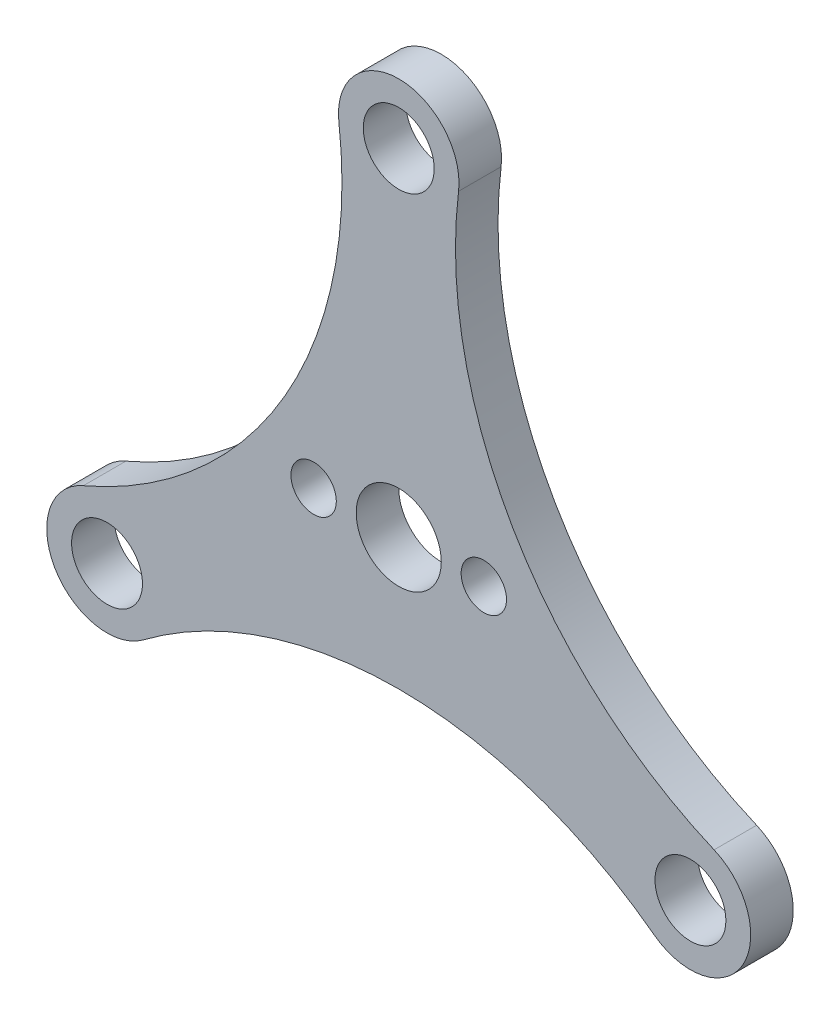
ISO-10303-21;
HEADER;
FILE_DESCRIPTION(('STEP AP214'),'2;1');
FILE_NAME('part.step','',(''),(''),'','','');
FILE_SCHEMA(('AUTOMOTIVE_DESIGN { 1 0 10303 214 1 1 1 1 }'));
ENDSEC;
DATA;
#1=APPLICATION_CONTEXT('core data for automotive mechanical design processes');
#2=APPLICATION_PROTOCOL_DEFINITION('international standard','automotive_design',2000,#1);
#3=PRODUCT_CONTEXT('',#1,'mechanical');
#4=PRODUCT('Part','Part','',(#3));
#5=PRODUCT_RELATED_PRODUCT_CATEGORY('part','',(#4));
#6=PRODUCT_DEFINITION_FORMATION('','',#4);
#7=PRODUCT_DEFINITION_CONTEXT('part definition',#1,'design');
#8=PRODUCT_DEFINITION('design','',#6,#7);
#9=PRODUCT_DEFINITION_SHAPE('','',#8);
#10=(LENGTH_UNIT() NAMED_UNIT(*) SI_UNIT(.MILLI.,.METRE.));
#11=(NAMED_UNIT(*) PLANE_ANGLE_UNIT() SI_UNIT($,.RADIAN.));
#12=(NAMED_UNIT(*) SI_UNIT($,.STERADIAN.) SOLID_ANGLE_UNIT());
#13=UNCERTAINTY_MEASURE_WITH_UNIT(LENGTH_MEASURE(1.E-05),#10,'distance_accuracy_value','');
#14=(GEOMETRIC_REPRESENTATION_CONTEXT(3) GLOBAL_UNCERTAINTY_ASSIGNED_CONTEXT((#13)) GLOBAL_UNIT_ASSIGNED_CONTEXT((#10,
#11,#12)) REPRESENTATION_CONTEXT('',''));
#15=CARTESIAN_POINT('',(0.,0.,0.));
#16=DIRECTION('',(0.,0.,1.));
#17=DIRECTION('',(1.,0.,0.));
#18=AXIS2_PLACEMENT_3D('',#15,#16,#17);
#19=CARTESIAN_POINT('',(-17.0006905864293,21.6903532864845,3.));
#20=DIRECTION('',(0.,0.,1.));
#21=DIRECTION('',(1.,0.,0.));
#22=AXIS2_PLACEMENT_3D('',#19,#20,#21);
#23=PLANE('',#22);
#24=CARTESIAN_POINT('',(20.5681033398804,-11.875,3.));
#25=DIRECTION('',(0.,0.,1.));
#26=DIRECTION('',(1.,0.,0.));
#27=AXIS2_PLACEMENT_3D('',#24,#25,#26);
#28=CIRCLE('',#27,2.5000000000001);
#29=CARTESIAN_POINT('',(23.0681033398805,-11.875,3.));
#30=VERTEX_POINT('',#29);
#31=EDGE_CURVE('E197',#30,#30,#28,.T.);
#32=ORIENTED_EDGE('',*,*,#31,.F.);
#33=EDGE_LOOP('',(#32));
#34=FACE_BOUND('',#33,.T.);
#35=CARTESIAN_POINT('',(6.,0.,3.));
#36=DIRECTION('',(0.,0.,1.));
#37=DIRECTION('',(1.,0.,0.));
#38=AXIS2_PLACEMENT_3D('',#35,#36,#37);
#39=CIRCLE('',#38,1.6);
#40=CARTESIAN_POINT('',(7.6,0.,3.));
#41=VERTEX_POINT('',#40);
#42=EDGE_CURVE('E209',#41,#41,#39,.T.);
#43=ORIENTED_EDGE('',*,*,#42,.F.);
#44=EDGE_LOOP('',(#43));
#45=FACE_BOUND('',#44,.T.);
#46=CARTESIAN_POINT('',(0.,23.75,3.));
#47=DIRECTION('',(0.,0.,1.));
#48=DIRECTION('',(1.,0.,0.));
#49=AXIS2_PLACEMENT_3D('',#46,#47,#48);
#50=CIRCLE('',#49,2.5);
#51=CARTESIAN_POINT('',(2.5,23.75,3.));
#52=VERTEX_POINT('',#51);
#53=EDGE_CURVE('E122',#52,#52,#50,.T.);
#54=ORIENTED_EDGE('',*,*,#53,.F.);
#55=EDGE_LOOP('',(#54));
#56=FACE_BOUND('',#55,.T.);
#57=CARTESIAN_POINT('',(-34.0013811728585,19.630706572969,3.));
#58=DIRECTION('',(0.,0.,-1.));
#59=DIRECTION('',(1.,0.,0.));
#60=AXIS2_PLACEMENT_3D('',#57,#58,#59);
#61=CIRCLE('',#60,30.);
#62=CARTESIAN_POINT('',(-4.21914948860289,23.2388468010254,3.));
#63=VERTEX_POINT('',#62);
#64=CARTESIAN_POINT('',(-22.2350064286442,-7.96553276101825,3.));
#65=VERTEX_POINT('',#64);
#66=EDGE_CURVE('E129',#63,#65,#61,.T.);
#67=ORIENTED_EDGE('',*,*,#66,.T.);
#68=CARTESIAN_POINT('',(-20.5681033398805,-11.8749999999998,3.));
#69=DIRECTION('',(0.,0.,1.));
#70=DIRECTION('',(1.,0.,0.));
#71=AXIS2_PLACEMENT_3D('',#68,#69,#70);
#72=CIRCLE('',#71,4.25);
#73=CARTESIAN_POINT('',(-18.0158569400414,-15.2733140400067,3.));
#74=VERTEX_POINT('',#73);
#75=EDGE_CURVE('E87',#65,#74,#72,.T.);
#76=ORIENTED_EDGE('',*,*,#75,.T.);
#77=CARTESIAN_POINT('',(0.,-39.2614131459379,3.));
#78=DIRECTION('',(0.,0.,-1.));
#79=DIRECTION('',(1.,0.,0.));
#80=AXIS2_PLACEMENT_3D('',#77,#78,#79);
#81=CIRCLE('',#80,30.);
#82=CARTESIAN_POINT('',(18.0158569400412,-15.2733140400069,3.));
#83=VERTEX_POINT('',#82);
#84=EDGE_CURVE('E100',#74,#83,#81,.T.);
#85=ORIENTED_EDGE('',*,*,#84,.T.);
#86=CARTESIAN_POINT('',(20.5681033398804,-11.875,3.));
#87=DIRECTION('',(0.,0.,1.));
#88=DIRECTION('',(1.,0.,0.));
#89=AXIS2_PLACEMENT_3D('',#86,#87,#88);
#90=CIRCLE('',#89,4.25);
#91=CARTESIAN_POINT('',(22.2350064286441,-7.96553276101843,3.));
#92=VERTEX_POINT('',#91);
#93=EDGE_CURVE('E94',#83,#92,#90,.T.);
#94=ORIENTED_EDGE('',*,*,#93,.T.);
#95=CARTESIAN_POINT('',(34.0013811728585,19.630706572969,3.));
#96=DIRECTION('',(0.,0.,-1.));
#97=DIRECTION('',(1.,0.,0.));
#98=AXIS2_PLACEMENT_3D('',#95,#96,#97);
#99=CIRCLE('',#98,30.);
#100=CARTESIAN_POINT('',(4.21914948860289,23.2388468010253,3.));
#101=VERTEX_POINT('',#100);
#102=EDGE_CURVE('E98',#92,#101,#99,.T.);
#103=ORIENTED_EDGE('',*,*,#102,.T.);
#104=CARTESIAN_POINT('',(0.,23.75,3.));
#105=DIRECTION('',(0.,0.,1.));
#106=DIRECTION('',(1.,0.,0.));
#107=AXIS2_PLACEMENT_3D('',#104,#105,#106);
#108=CIRCLE('',#107,4.25);
#109=EDGE_CURVE('E50',#101,#63,#108,.T.);
#110=ORIENTED_EDGE('',*,*,#109,.T.);
#111=EDGE_LOOP('',(#67,#76,#85,#94,#103,#110));
#112=FACE_BOUND('',#111,.T.);
#113=CARTESIAN_POINT('',(0.,0.,3.));
#114=DIRECTION('',(0.,0.,1.));
#115=DIRECTION('',(1.,0.,0.));
#116=AXIS2_PLACEMENT_3D('',#113,#114,#115);
#117=CIRCLE('',#116,3.);
#118=CARTESIAN_POINT('',(3.,0.,3.));
#119=VERTEX_POINT('',#118);
#120=EDGE_CURVE('E215',#119,#119,#117,.T.);
#121=ORIENTED_EDGE('',*,*,#120,.F.);
#122=EDGE_LOOP('',(#121));
#123=FACE_BOUND('',#122,.T.);
#124=CARTESIAN_POINT('',(-6.,0.,3.));
#125=DIRECTION('',(0.,0.,1.));
#126=DIRECTION('',(1.,0.,0.));
#127=AXIS2_PLACEMENT_3D('',#124,#125,#126);
#128=CIRCLE('',#127,1.6);
#129=CARTESIAN_POINT('',(-4.4,0.,3.));
#130=VERTEX_POINT('',#129);
#131=EDGE_CURVE('E203',#130,#130,#128,.T.);
#132=ORIENTED_EDGE('',*,*,#131,.F.);
#133=EDGE_LOOP('',(#132));
#134=FACE_BOUND('',#133,.T.);
#135=CARTESIAN_POINT('',(-20.5681033398804,-11.875,3.));
#136=DIRECTION('',(0.,0.,1.));
#137=DIRECTION('',(1.,0.,0.));
#138=AXIS2_PLACEMENT_3D('',#135,#136,#137);
#139=CIRCLE('',#138,2.50000000000022);
#140=CARTESIAN_POINT('',(-18.0681033398802,-11.875,3.));
#141=VERTEX_POINT('',#140);
#142=EDGE_CURVE('E188',#141,#141,#139,.T.);
#143=ORIENTED_EDGE('',*,*,#142,.F.);
#144=EDGE_LOOP('',(#143));
#145=FACE_BOUND('',#144,.T.);
#146=ADVANCED_FACE('F33',(#34,#45,#56,#112,#123,#134,#145),#23,.T.);
#147=CARTESIAN_POINT('',(-17.0006905864293,21.6903532864845,0.));
#148=DIRECTION('',(0.,0.,1.));
#149=DIRECTION('',(1.,0.,0.));
#150=AXIS2_PLACEMENT_3D('',#147,#148,#149);
#151=PLANE('',#150);
#152=CARTESIAN_POINT('',(-34.0013811728585,19.630706572969,0.));
#153=DIRECTION('',(0.,0.,-1.));
#154=DIRECTION('',(1.,0.,0.));
#155=AXIS2_PLACEMENT_3D('',#152,#153,#154);
#156=CIRCLE('',#155,30.);
#157=CARTESIAN_POINT('',(-4.21914948860289,23.2388468010254,0.));
#158=VERTEX_POINT('',#157);
#159=CARTESIAN_POINT('',(-22.2350064286442,-7.96553276101825,0.));
#160=VERTEX_POINT('',#159);
#161=EDGE_CURVE('E118',#158,#160,#156,.T.);
#162=ORIENTED_EDGE('',*,*,#161,.F.);
#163=CARTESIAN_POINT('',(0.,23.75,0.));
#164=DIRECTION('',(0.,0.,1.));
#165=DIRECTION('',(1.,0.,0.));
#166=AXIS2_PLACEMENT_3D('',#163,#164,#165);
#167=CIRCLE('',#166,4.25);
#168=CARTESIAN_POINT('',(4.21914948860289,23.2388468010253,0.));
#169=VERTEX_POINT('',#168);
#170=EDGE_CURVE('E79',#169,#158,#167,.T.);
#171=ORIENTED_EDGE('',*,*,#170,.F.);
#172=CARTESIAN_POINT('',(34.0013811728585,19.630706572969,0.));
#173=DIRECTION('',(0.,0.,-1.));
#174=DIRECTION('',(1.,0.,0.));
#175=AXIS2_PLACEMENT_3D('',#172,#173,#174);
#176=CIRCLE('',#175,30.);
#177=CARTESIAN_POINT('',(22.2350064286441,-7.96553276101843,0.));
#178=VERTEX_POINT('',#177);
#179=EDGE_CURVE('E73',#178,#169,#176,.T.);
#180=ORIENTED_EDGE('',*,*,#179,.F.);
#181=CARTESIAN_POINT('',(20.5681033398804,-11.875,0.));
#182=DIRECTION('',(0.,0.,1.));
#183=DIRECTION('',(1.,0.,0.));
#184=AXIS2_PLACEMENT_3D('',#181,#182,#183);
#185=CIRCLE('',#184,4.25);
#186=CARTESIAN_POINT('',(18.0158569400412,-15.2733140400069,0.));
#187=VERTEX_POINT('',#186);
#188=EDGE_CURVE('E108',#187,#178,#185,.T.);
#189=ORIENTED_EDGE('',*,*,#188,.F.);
#190=CARTESIAN_POINT('',(0.,-39.2614131459379,0.));
#191=DIRECTION('',(0.,0.,-1.));
#192=DIRECTION('',(1.,0.,0.));
#193=AXIS2_PLACEMENT_3D('',#190,#191,#192);
#194=CIRCLE('',#193,30.);
#195=CARTESIAN_POINT('',(-18.0158569400414,-15.2733140400067,0.));
#196=VERTEX_POINT('',#195);
#197=EDGE_CURVE('E124',#196,#187,#194,.T.);
#198=ORIENTED_EDGE('',*,*,#197,.F.);
#199=CARTESIAN_POINT('',(-20.5681033398805,-11.8749999999998,0.));
#200=DIRECTION('',(0.,0.,1.));
#201=DIRECTION('',(1.,0.,0.));
#202=AXIS2_PLACEMENT_3D('',#199,#200,#201);
#203=CIRCLE('',#202,4.25);
#204=EDGE_CURVE('E121',#160,#196,#203,.T.);
#205=ORIENTED_EDGE('',*,*,#204,.F.);
#206=EDGE_LOOP('',(#162,#171,#180,#189,#198,#205));
#207=FACE_BOUND('',#206,.T.);
#208=CARTESIAN_POINT('',(0.,23.75,0.));
#209=DIRECTION('',(0.,0.,1.));
#210=DIRECTION('',(1.,0.,0.));
#211=AXIS2_PLACEMENT_3D('',#208,#209,#210);
#212=CIRCLE('',#211,2.5);
#213=CARTESIAN_POINT('',(2.5,23.75,0.));
#214=VERTEX_POINT('',#213);
#215=EDGE_CURVE('E218',#214,#214,#212,.T.);
#216=ORIENTED_EDGE('',*,*,#215,.T.);
#217=EDGE_LOOP('',(#216));
#218=FACE_BOUND('',#217,.T.);
#219=CARTESIAN_POINT('',(0.,0.,0.));
#220=DIRECTION('',(0.,0.,1.));
#221=DIRECTION('',(1.,0.,0.));
#222=AXIS2_PLACEMENT_3D('',#219,#220,#221);
#223=CIRCLE('',#222,3.);
#224=CARTESIAN_POINT('',(3.,0.,0.));
#225=VERTEX_POINT('',#224);
#226=EDGE_CURVE('E212',#225,#225,#223,.T.);
#227=ORIENTED_EDGE('',*,*,#226,.T.);
#228=EDGE_LOOP('',(#227));
#229=FACE_BOUND('',#228,.T.);
#230=CARTESIAN_POINT('',(6.,0.,0.));
#231=DIRECTION('',(0.,0.,1.));
#232=DIRECTION('',(1.,0.,0.));
#233=AXIS2_PLACEMENT_3D('',#230,#231,#232);
#234=CIRCLE('',#233,1.6);
#235=CARTESIAN_POINT('',(7.6,0.,0.));
#236=VERTEX_POINT('',#235);
#237=EDGE_CURVE('E206',#236,#236,#234,.T.);
#238=ORIENTED_EDGE('',*,*,#237,.T.);
#239=EDGE_LOOP('',(#238));
#240=FACE_BOUND('',#239,.T.);
#241=CARTESIAN_POINT('',(-6.,0.,0.));
#242=DIRECTION('',(0.,0.,1.));
#243=DIRECTION('',(1.,0.,0.));
#244=AXIS2_PLACEMENT_3D('',#241,#242,#243);
#245=CIRCLE('',#244,1.6);
#246=CARTESIAN_POINT('',(-4.4,0.,0.));
#247=VERTEX_POINT('',#246);
#248=EDGE_CURVE('E200',#247,#247,#245,.T.);
#249=ORIENTED_EDGE('',*,*,#248,.T.);
#250=EDGE_LOOP('',(#249));
#251=FACE_BOUND('',#250,.T.);
#252=CARTESIAN_POINT('',(20.5681033398804,-11.875,0.));
#253=DIRECTION('',(0.,0.,1.));
#254=DIRECTION('',(1.,0.,0.));
#255=AXIS2_PLACEMENT_3D('',#252,#253,#254);
#256=CIRCLE('',#255,2.5000000000001);
#257=CARTESIAN_POINT('',(23.0681033398805,-11.875,0.));
#258=VERTEX_POINT('',#257);
#259=EDGE_CURVE('E194',#258,#258,#256,.T.);
#260=ORIENTED_EDGE('',*,*,#259,.T.);
#261=EDGE_LOOP('',(#260));
#262=FACE_BOUND('',#261,.T.);
#263=CARTESIAN_POINT('',(-20.5681033398804,-11.875,0.));
#264=DIRECTION('',(0.,0.,1.));
#265=DIRECTION('',(1.,0.,0.));
#266=AXIS2_PLACEMENT_3D('',#263,#264,#265);
#267=CIRCLE('',#266,2.50000000000022);
#268=CARTESIAN_POINT('',(-18.0681033398802,-11.875,0.));
#269=VERTEX_POINT('',#268);
#270=EDGE_CURVE('E191',#269,#269,#267,.T.);
#271=ORIENTED_EDGE('',*,*,#270,.T.);
#272=EDGE_LOOP('',(#271));
#273=FACE_BOUND('',#272,.T.);
#274=ADVANCED_FACE('F138',(#207,#218,#229,#240,#251,#262,#273),#151,.F.);
#275=CARTESIAN_POINT('',(-34.0013811728585,19.630706572969,3.));
#276=DIRECTION('',(0.,0.,-1.));
#277=DIRECTION('',(-1.,0.,0.));
#278=AXIS2_PLACEMENT_3D('',#275,#276,#277);
#279=CYLINDRICAL_SURFACE('',#278,30.);
#280=ORIENTED_EDGE('',*,*,#161,.T.);
#281=DIRECTION('',(0.,0.,-1.));
#282=VECTOR('',#281,1.);
#283=CARTESIAN_POINT('',(-22.2350064286442,-7.96553276101825,3.));
#284=LINE('',#283,#282);
#285=EDGE_CURVE('E11',#65,#160,#284,.T.);
#286=ORIENTED_EDGE('',*,*,#285,.F.);
#287=ORIENTED_EDGE('',*,*,#66,.F.);
#288=DIRECTION('',(0.,0.,-1.));
#289=VECTOR('',#288,1.);
#290=CARTESIAN_POINT('',(-4.21914948860289,23.2388468010254,3.));
#291=LINE('',#290,#289);
#292=EDGE_CURVE('E114',#63,#158,#291,.T.);
#293=ORIENTED_EDGE('',*,*,#292,.T.);
#294=EDGE_LOOP('',(#280,#286,#287,#293));
#295=FACE_BOUND('',#294,.T.);
#296=ADVANCED_FACE('F35',(#295),#279,.F.);
#297=CARTESIAN_POINT('',(-20.5681033398805,-11.8749999999998,3.));
#298=DIRECTION('',(0.,0.,-1.));
#299=DIRECTION('',(-1.,0.,0.));
#300=AXIS2_PLACEMENT_3D('',#297,#298,#299);
#301=CYLINDRICAL_SURFACE('',#300,4.25);
#302=ORIENTED_EDGE('',*,*,#204,.T.);
#303=DIRECTION('',(0.,0.,-1.));
#304=VECTOR('',#303,1.);
#305=CARTESIAN_POINT('',(-18.0158569400414,-15.2733140400067,3.));
#306=LINE('',#305,#304);
#307=EDGE_CURVE('E42',#74,#196,#306,.T.);
#308=ORIENTED_EDGE('',*,*,#307,.F.);
#309=ORIENTED_EDGE('',*,*,#75,.F.);
#310=ORIENTED_EDGE('',*,*,#285,.T.);
#311=EDGE_LOOP('',(#302,#308,#309,#310));
#312=FACE_BOUND('',#311,.T.);
#313=ADVANCED_FACE('F294',(#312),#301,.T.);
#314=CARTESIAN_POINT('',(0.,-39.2614131459379,3.));
#315=DIRECTION('',(0.,0.,-1.));
#316=DIRECTION('',(-1.,0.,0.));
#317=AXIS2_PLACEMENT_3D('',#314,#315,#316);
#318=CYLINDRICAL_SURFACE('',#317,30.);
#319=ORIENTED_EDGE('',*,*,#197,.T.);
#320=DIRECTION('',(0.,0.,-1.));
#321=VECTOR('',#320,1.);
#322=CARTESIAN_POINT('',(18.0158569400412,-15.2733140400069,3.));
#323=LINE('',#322,#321);
#324=EDGE_CURVE('E109',#83,#187,#323,.T.);
#325=ORIENTED_EDGE('',*,*,#324,.F.);
#326=ORIENTED_EDGE('',*,*,#84,.F.);
#327=ORIENTED_EDGE('',*,*,#307,.T.);
#328=EDGE_LOOP('',(#319,#325,#326,#327));
#329=FACE_BOUND('',#328,.T.);
#330=ADVANCED_FACE('F135',(#329),#318,.F.);
#331=CARTESIAN_POINT('',(20.5681033398804,-11.875,3.));
#332=DIRECTION('',(0.,0.,-1.));
#333=DIRECTION('',(-1.,0.,0.));
#334=AXIS2_PLACEMENT_3D('',#331,#332,#333);
#335=CYLINDRICAL_SURFACE('',#334,4.25);
#336=ORIENTED_EDGE('',*,*,#188,.T.);
#337=DIRECTION('',(0.,0.,-1.));
#338=VECTOR('',#337,1.);
#339=CARTESIAN_POINT('',(22.2350064286441,-7.96553276101843,3.));
#340=LINE('',#339,#338);
#341=EDGE_CURVE('E105',#92,#178,#340,.T.);
#342=ORIENTED_EDGE('',*,*,#341,.F.);
#343=ORIENTED_EDGE('',*,*,#93,.F.);
#344=ORIENTED_EDGE('',*,*,#324,.T.);
#345=EDGE_LOOP('',(#336,#342,#343,#344));
#346=FACE_BOUND('',#345,.T.);
#347=ADVANCED_FACE('F106',(#346),#335,.T.);
#348=CARTESIAN_POINT('',(34.0013811728585,19.630706572969,3.));
#349=DIRECTION('',(0.,0.,-1.));
#350=DIRECTION('',(-1.,0.,0.));
#351=AXIS2_PLACEMENT_3D('',#348,#349,#350);
#352=CYLINDRICAL_SURFACE('',#351,30.);
#353=ORIENTED_EDGE('',*,*,#179,.T.);
#354=DIRECTION('',(0.,0.,-1.));
#355=VECTOR('',#354,1.);
#356=CARTESIAN_POINT('',(4.21914948860289,23.2388468010253,3.));
#357=LINE('',#356,#355);
#358=EDGE_CURVE('E110',#101,#169,#357,.T.);
#359=ORIENTED_EDGE('',*,*,#358,.F.);
#360=ORIENTED_EDGE('',*,*,#102,.F.);
#361=ORIENTED_EDGE('',*,*,#341,.T.);
#362=EDGE_LOOP('',(#353,#359,#360,#361));
#363=FACE_BOUND('',#362,.T.);
#364=ADVANCED_FACE('F112',(#363),#352,.F.);
#365=CARTESIAN_POINT('',(0.,23.75,3.));
#366=DIRECTION('',(0.,0.,-1.));
#367=DIRECTION('',(-1.,0.,0.));
#368=AXIS2_PLACEMENT_3D('',#365,#366,#367);
#369=CYLINDRICAL_SURFACE('',#368,4.25);
#370=ORIENTED_EDGE('',*,*,#170,.T.);
#371=ORIENTED_EDGE('',*,*,#292,.F.);
#372=ORIENTED_EDGE('',*,*,#109,.F.);
#373=ORIENTED_EDGE('',*,*,#358,.T.);
#374=EDGE_LOOP('',(#370,#371,#372,#373));
#375=FACE_BOUND('',#374,.T.);
#376=ADVANCED_FACE('F143',(#375),#369,.T.);
#377=CARTESIAN_POINT('',(0.,23.75,3.));
#378=DIRECTION('',(0.,0.,-1.));
#379=DIRECTION('',(-1.,0.,0.));
#380=AXIS2_PLACEMENT_3D('',#377,#378,#379);
#381=CYLINDRICAL_SURFACE('',#380,2.5);
#382=ORIENTED_EDGE('',*,*,#53,.T.);
#383=EDGE_LOOP('',(#382));
#384=FACE_BOUND('',#383,.T.);
#385=ORIENTED_EDGE('',*,*,#215,.F.);
#386=EDGE_LOOP('',(#385));
#387=FACE_BOUND('',#386,.T.);
#388=ADVANCED_FACE('F145',(#384,#387),#381,.F.);
#389=CARTESIAN_POINT('',(0.,0.,3.));
#390=DIRECTION('',(0.,0.,-1.));
#391=DIRECTION('',(-1.,0.,0.));
#392=AXIS2_PLACEMENT_3D('',#389,#390,#391);
#393=CYLINDRICAL_SURFACE('',#392,3.);
#394=ORIENTED_EDGE('',*,*,#120,.T.);
#395=EDGE_LOOP('',(#394));
#396=FACE_BOUND('',#395,.T.);
#397=ORIENTED_EDGE('',*,*,#226,.F.);
#398=EDGE_LOOP('',(#397));
#399=FACE_BOUND('',#398,.T.);
#400=ADVANCED_FACE('F151',(#396,#399),#393,.F.);
#401=CARTESIAN_POINT('',(6.,0.,3.));
#402=DIRECTION('',(0.,0.,-1.));
#403=DIRECTION('',(-1.,0.,0.));
#404=AXIS2_PLACEMENT_3D('',#401,#402,#403);
#405=CYLINDRICAL_SURFACE('',#404,1.6);
#406=ORIENTED_EDGE('',*,*,#42,.T.);
#407=EDGE_LOOP('',(#406));
#408=FACE_BOUND('',#407,.T.);
#409=ORIENTED_EDGE('',*,*,#237,.F.);
#410=EDGE_LOOP('',(#409));
#411=FACE_BOUND('',#410,.T.);
#412=ADVANCED_FACE('F167',(#408,#411),#405,.F.);
#413=CARTESIAN_POINT('',(-6.,0.,3.));
#414=DIRECTION('',(0.,0.,-1.));
#415=DIRECTION('',(-1.,0.,0.));
#416=AXIS2_PLACEMENT_3D('',#413,#414,#415);
#417=CYLINDRICAL_SURFACE('',#416,1.6);
#418=ORIENTED_EDGE('',*,*,#131,.T.);
#419=EDGE_LOOP('',(#418));
#420=FACE_BOUND('',#419,.T.);
#421=ORIENTED_EDGE('',*,*,#248,.F.);
#422=EDGE_LOOP('',(#421));
#423=FACE_BOUND('',#422,.T.);
#424=ADVANCED_FACE('F171',(#420,#423),#417,.F.);
#425=CARTESIAN_POINT('',(20.5681033398804,-11.875,3.));
#426=DIRECTION('',(0.,0.,-1.));
#427=DIRECTION('',(-1.,0.,0.));
#428=AXIS2_PLACEMENT_3D('',#425,#426,#427);
#429=CYLINDRICAL_SURFACE('',#428,2.5000000000001);
#430=ORIENTED_EDGE('',*,*,#31,.T.);
#431=EDGE_LOOP('',(#430));
#432=FACE_BOUND('',#431,.T.);
#433=ORIENTED_EDGE('',*,*,#259,.F.);
#434=EDGE_LOOP('',(#433));
#435=FACE_BOUND('',#434,.T.);
#436=ADVANCED_FACE('F175',(#432,#435),#429,.F.);
#437=CARTESIAN_POINT('',(-20.5681033398804,-11.875,3.));
#438=DIRECTION('',(0.,0.,-1.));
#439=DIRECTION('',(-1.,0.,0.));
#440=AXIS2_PLACEMENT_3D('',#437,#438,#439);
#441=CYLINDRICAL_SURFACE('',#440,2.50000000000022);
#442=ORIENTED_EDGE('',*,*,#142,.T.);
#443=EDGE_LOOP('',(#442));
#444=FACE_BOUND('',#443,.T.);
#445=ORIENTED_EDGE('',*,*,#270,.F.);
#446=EDGE_LOOP('',(#445));
#447=FACE_BOUND('',#446,.T.);
#448=ADVANCED_FACE('F179',(#444,#447),#441,.F.);
#449=CLOSED_SHELL('',(#146,#274,#296,#313,#330,#347,#364,#376,#388,#400,#412,#424,#436,#448));
#450=MANIFOLD_SOLID_BREP('B2',#449);
#451=ADVANCED_BREP_SHAPE_REPRESENTATION('',(#18,#450),#14);
#452=SHAPE_DEFINITION_REPRESENTATION(#9,#451);
ENDSEC;
END-ISO-10303-21;
